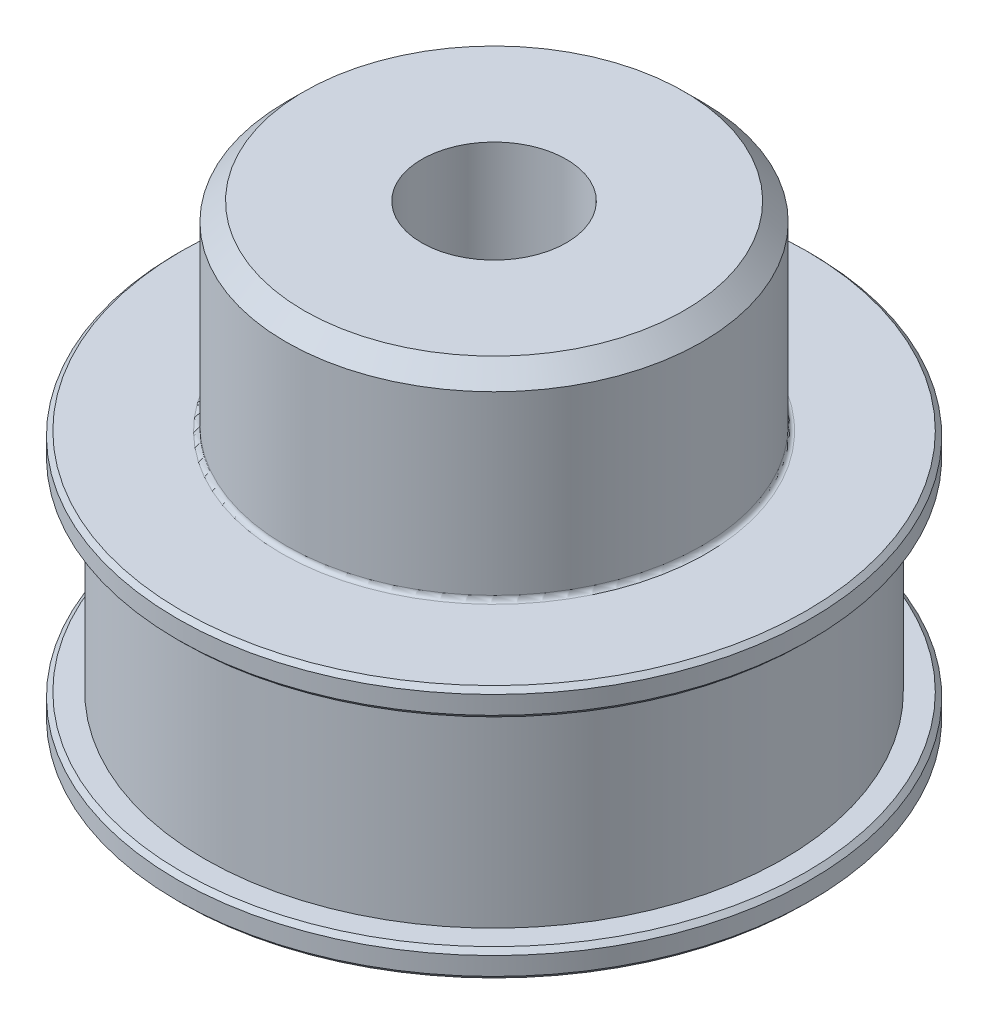
ISO-10303-21;
HEADER;
FILE_DESCRIPTION(('STEP AP214'),'2;1');
FILE_NAME('part.step','',(''),(''),'','','');
FILE_SCHEMA(('AUTOMOTIVE_DESIGN { 1 0 10303 214 1 1 1 1 }'));
ENDSEC;
DATA;
#1=APPLICATION_CONTEXT('core data for automotive mechanical design processes');
#2=APPLICATION_PROTOCOL_DEFINITION('international standard','automotive_design',2000,#1);
#3=PRODUCT_CONTEXT('',#1,'mechanical');
#4=PRODUCT('Part','Part','',(#3));
#5=PRODUCT_RELATED_PRODUCT_CATEGORY('part','',(#4));
#6=PRODUCT_DEFINITION_FORMATION('','',#4);
#7=PRODUCT_DEFINITION_CONTEXT('part definition',#1,'design');
#8=PRODUCT_DEFINITION('design','',#6,#7);
#9=PRODUCT_DEFINITION_SHAPE('','',#8);
#10=(LENGTH_UNIT() NAMED_UNIT(*) SI_UNIT(.MILLI.,.METRE.));
#11=(NAMED_UNIT(*) PLANE_ANGLE_UNIT() SI_UNIT($,.RADIAN.));
#12=(NAMED_UNIT(*) SI_UNIT($,.STERADIAN.) SOLID_ANGLE_UNIT());
#13=UNCERTAINTY_MEASURE_WITH_UNIT(LENGTH_MEASURE(1.E-05),#10,'distance_accuracy_value','');
#14=(GEOMETRIC_REPRESENTATION_CONTEXT(3) GLOBAL_UNCERTAINTY_ASSIGNED_CONTEXT((#13)) GLOBAL_UNIT_ASSIGNED_CONTEXT((#10,
#11,#12)) REPRESENTATION_CONTEXT('',''));
#15=CARTESIAN_POINT('',(0.,0.,0.));
#16=DIRECTION('',(0.,0.,1.));
#17=DIRECTION('',(1.,0.,0.));
#18=AXIS2_PLACEMENT_3D('',#15,#16,#17);
#19=CARTESIAN_POINT('',(0.,1.5,0.));
#20=DIRECTION('',(0.,-1.,0.));
#21=DIRECTION('',(0.,0.,-1.));
#22=AXIS2_PLACEMENT_3D('',#19,#20,#21);
#23=CYLINDRICAL_SURFACE('',#22,17.5);
#24=CARTESIAN_POINT('',(0.,0.25,0.));
#25=DIRECTION('',(0.,1.,0.));
#26=DIRECTION('',(0.,0.,1.));
#27=AXIS2_PLACEMENT_3D('',#24,#25,#26);
#28=CIRCLE('',#27,17.5);
#29=CARTESIAN_POINT('',(0.,0.25,17.5));
#30=VERTEX_POINT('',#29);
#31=EDGE_CURVE('E64',#30,#30,#28,.T.);
#32=ORIENTED_EDGE('',*,*,#31,.T.);
#33=EDGE_LOOP('',(#32));
#34=FACE_BOUND('',#33,.T.);
#35=CARTESIAN_POINT('',(0.,1.24999999999997,0.));
#36=DIRECTION('',(0.,1.,0.));
#37=DIRECTION('',(0.,0.,1.));
#38=AXIS2_PLACEMENT_3D('',#35,#36,#37);
#39=CIRCLE('',#38,17.5);
#40=CARTESIAN_POINT('',(0.,1.24999999999997,17.5));
#41=VERTEX_POINT('',#40);
#42=EDGE_CURVE('E67',#41,#41,#39,.F.);
#43=ORIENTED_EDGE('',*,*,#42,.T.);
#44=EDGE_LOOP('',(#43));
#45=FACE_BOUND('',#44,.T.);
#46=ADVANCED_FACE('F32',(#34,#45),#23,.T.);
#47=CARTESIAN_POINT('',(0.,1.5,0.));
#48=DIRECTION('',(0.,1.,0.));
#49=DIRECTION('',(0.,0.,1.));
#50=AXIS2_PLACEMENT_3D('',#47,#48,#49);
#51=PLANE('',#50);
#52=CARTESIAN_POINT('',(0.,1.5,0.));
#53=DIRECTION('',(0.,1.,0.));
#54=DIRECTION('',(0.,0.,1.));
#55=AXIS2_PLACEMENT_3D('',#52,#53,#54);
#56=CIRCLE('',#55,17.25);
#57=CARTESIAN_POINT('',(0.,1.5,17.25));
#58=VERTEX_POINT('',#57);
#59=EDGE_CURVE('E58',#58,#58,#56,.T.);
#60=ORIENTED_EDGE('',*,*,#59,.T.);
#61=EDGE_LOOP('',(#60));
#62=FACE_BOUND('',#61,.T.);
#63=CARTESIAN_POINT('',(0.,1.5,0.));
#64=DIRECTION('',(0.,1.,0.));
#65=DIRECTION('',(0.,0.,1.));
#66=AXIS2_PLACEMENT_3D('',#63,#64,#65);
#67=CIRCLE('',#66,16.);
#68=CARTESIAN_POINT('',(0.,1.5,16.));
#69=VERTEX_POINT('',#68);
#70=EDGE_CURVE('E80',#69,#69,#67,.T.);
#71=ORIENTED_EDGE('',*,*,#70,.F.);
#72=EDGE_LOOP('',(#71));
#73=FACE_BOUND('',#72,.T.);
#74=ADVANCED_FACE('F108',(#62,#73),#51,.T.);
#75=CARTESIAN_POINT('',(0.,0.,0.));
#76=DIRECTION('',(0.,1.,0.));
#77=DIRECTION('',(0.,0.,1.));
#78=AXIS2_PLACEMENT_3D('',#75,#76,#77);
#79=PLANE('',#78);
#80=CARTESIAN_POINT('',(0.,0.,0.));
#81=DIRECTION('',(0.,1.,0.));
#82=DIRECTION('',(0.,0.,1.));
#83=AXIS2_PLACEMENT_3D('',#80,#81,#82);
#84=CIRCLE('',#83,17.25);
#85=CARTESIAN_POINT('',(0.,0.,17.25));
#86=VERTEX_POINT('',#85);
#87=EDGE_CURVE('E61',#86,#86,#84,.F.);
#88=ORIENTED_EDGE('',*,*,#87,.T.);
#89=EDGE_LOOP('',(#88));
#90=FACE_BOUND('',#89,.T.);
#91=CARTESIAN_POINT('',(0.,0.,0.));
#92=DIRECTION('',(0.,1.,0.));
#93=DIRECTION('',(0.,0.,1.));
#94=AXIS2_PLACEMENT_3D('',#91,#92,#93);
#95=CIRCLE('',#94,4.);
#96=CARTESIAN_POINT('',(0.,0.,4.));
#97=VERTEX_POINT('',#96);
#98=EDGE_CURVE('E81',#97,#97,#95,.T.);
#99=ORIENTED_EDGE('',*,*,#98,.T.);
#100=EDGE_LOOP('',(#99));
#101=FACE_BOUND('',#100,.T.);
#102=ADVANCED_FACE('F89',(#90,#101),#79,.F.);
#103=CARTESIAN_POINT('',(0.,12.5,0.));
#104=DIRECTION('',(0.,-1.,0.));
#105=DIRECTION('',(0.,0.,-1.));
#106=AXIS2_PLACEMENT_3D('',#103,#104,#105);
#107=CYLINDRICAL_SURFACE('',#106,16.);
#108=CARTESIAN_POINT('',(0.,12.5,0.));
#109=DIRECTION('',(0.,1.,0.));
#110=DIRECTION('',(0.,0.,1.));
#111=AXIS2_PLACEMENT_3D('',#108,#109,#110);
#112=CIRCLE('',#111,16.);
#113=CARTESIAN_POINT('',(0.,12.5,16.));
#114=VERTEX_POINT('',#113);
#115=EDGE_CURVE('E76',#114,#114,#112,.T.);
#116=ORIENTED_EDGE('',*,*,#115,.F.);
#117=EDGE_LOOP('',(#116));
#118=FACE_BOUND('',#117,.T.);
#119=ORIENTED_EDGE('',*,*,#70,.T.);
#120=EDGE_LOOP('',(#119));
#121=FACE_BOUND('',#120,.T.);
#122=ADVANCED_FACE('F151',(#118,#121),#107,.T.);
#123=CARTESIAN_POINT('',(0.,14.,0.));
#124=DIRECTION('',(0.,-1.,0.));
#125=DIRECTION('',(0.,0.,-1.));
#126=AXIS2_PLACEMENT_3D('',#123,#124,#125);
#127=CYLINDRICAL_SURFACE('',#126,17.5);
#128=CARTESIAN_POINT('',(0.,12.75,0.));
#129=DIRECTION('',(0.,1.,0.));
#130=DIRECTION('',(0.,0.,1.));
#131=AXIS2_PLACEMENT_3D('',#128,#129,#130);
#132=CIRCLE('',#131,17.5);
#133=CARTESIAN_POINT('',(0.,12.75,17.5));
#134=VERTEX_POINT('',#133);
#135=EDGE_CURVE('E52',#134,#134,#132,.T.);
#136=ORIENTED_EDGE('',*,*,#135,.T.);
#137=EDGE_LOOP('',(#136));
#138=FACE_BOUND('',#137,.T.);
#139=CARTESIAN_POINT('',(0.,13.75,0.));
#140=DIRECTION('',(0.,1.,0.));
#141=DIRECTION('',(0.,0.,1.));
#142=AXIS2_PLACEMENT_3D('',#139,#140,#141);
#143=CIRCLE('',#142,17.5);
#144=CARTESIAN_POINT('',(0.,13.75,17.5));
#145=VERTEX_POINT('',#144);
#146=EDGE_CURVE('E55',#145,#145,#143,.F.);
#147=ORIENTED_EDGE('',*,*,#146,.T.);
#148=EDGE_LOOP('',(#147));
#149=FACE_BOUND('',#148,.T.);
#150=ADVANCED_FACE('F143',(#138,#149),#127,.T.);
#151=CARTESIAN_POINT('',(0.,14.,0.));
#152=DIRECTION('',(0.,1.,0.));
#153=DIRECTION('',(0.,0.,1.));
#154=AXIS2_PLACEMENT_3D('',#151,#152,#153);
#155=PLANE('',#154);
#156=CARTESIAN_POINT('',(0.,14.,0.));
#157=DIRECTION('',(0.,1.,0.));
#158=DIRECTION('',(0.,0.,1.));
#159=AXIS2_PLACEMENT_3D('',#156,#157,#158);
#160=CIRCLE('',#159,11.75);
#161=CARTESIAN_POINT('',(0.,14.,11.75));
#162=VERTEX_POINT('',#161);
#163=EDGE_CURVE('E10',#162,#162,#160,.F.);
#164=ORIENTED_EDGE('',*,*,#163,.T.);
#165=EDGE_LOOP('',(#164));
#166=FACE_BOUND('',#165,.T.);
#167=CARTESIAN_POINT('',(0.,14.,0.));
#168=DIRECTION('',(0.,1.,0.));
#169=DIRECTION('',(0.,0.,1.));
#170=AXIS2_PLACEMENT_3D('',#167,#168,#169);
#171=CIRCLE('',#170,17.25);
#172=CARTESIAN_POINT('',(0.,14.,17.25));
#173=VERTEX_POINT('',#172);
#174=EDGE_CURVE('E43',#173,#173,#171,.T.);
#175=ORIENTED_EDGE('',*,*,#174,.T.);
#176=EDGE_LOOP('',(#175));
#177=FACE_BOUND('',#176,.T.);
#178=ADVANCED_FACE('F140',(#166,#177),#155,.T.);
#179=CARTESIAN_POINT('',(0.,12.5,0.));
#180=DIRECTION('',(0.,1.,0.));
#181=DIRECTION('',(0.,0.,1.));
#182=AXIS2_PLACEMENT_3D('',#179,#180,#181);
#183=PLANE('',#182);
#184=CARTESIAN_POINT('',(0.,12.5,0.));
#185=DIRECTION('',(0.,1.,0.));
#186=DIRECTION('',(0.,0.,1.));
#187=AXIS2_PLACEMENT_3D('',#184,#185,#186);
#188=CIRCLE('',#187,17.25);
#189=CARTESIAN_POINT('',(0.,12.5,17.25));
#190=VERTEX_POINT('',#189);
#191=EDGE_CURVE('E47',#190,#190,#188,.F.);
#192=ORIENTED_EDGE('',*,*,#191,.T.);
#193=EDGE_LOOP('',(#192));
#194=FACE_BOUND('',#193,.T.);
#195=ORIENTED_EDGE('',*,*,#115,.T.);
#196=EDGE_LOOP('',(#195));
#197=FACE_BOUND('',#196,.T.);
#198=ADVANCED_FACE('F142',(#194,#197),#183,.F.);
#199=CARTESIAN_POINT('',(0.,25.,0.));
#200=DIRECTION('',(0.,-1.,0.));
#201=DIRECTION('',(0.,0.,-1.));
#202=AXIS2_PLACEMENT_3D('',#199,#200,#201);
#203=CYLINDRICAL_SURFACE('',#202,11.5);
#204=CARTESIAN_POINT('',(0.,14.25,0.));
#205=DIRECTION('',(0.,1.,0.));
#206=DIRECTION('',(0.,0.,1.));
#207=AXIS2_PLACEMENT_3D('',#204,#205,#206);
#208=CIRCLE('',#207,11.5);
#209=CARTESIAN_POINT('',(0.,14.25,11.5));
#210=VERTEX_POINT('',#209);
#211=EDGE_CURVE('E39',#210,#210,#208,.T.);
#212=ORIENTED_EDGE('',*,*,#211,.T.);
#213=EDGE_LOOP('',(#212));
#214=FACE_BOUND('',#213,.T.);
#215=CARTESIAN_POINT('',(0.,24.,0.));
#216=DIRECTION('',(0.,1.,0.));
#217=DIRECTION('',(0.,0.,1.));
#218=AXIS2_PLACEMENT_3D('',#215,#216,#217);
#219=CIRCLE('',#218,11.5);
#220=CARTESIAN_POINT('',(0.,24.,11.5));
#221=VERTEX_POINT('',#220);
#222=EDGE_CURVE('E70',#221,#221,#219,.F.);
#223=ORIENTED_EDGE('',*,*,#222,.T.);
#224=EDGE_LOOP('',(#223));
#225=FACE_BOUND('',#224,.T.);
#226=ADVANCED_FACE('F104',(#214,#225),#203,.T.);
#227=CARTESIAN_POINT('',(0.,25.,0.));
#228=DIRECTION('',(0.,1.,0.));
#229=DIRECTION('',(0.,0.,1.));
#230=AXIS2_PLACEMENT_3D('',#227,#228,#229);
#231=PLANE('',#230);
#232=CARTESIAN_POINT('',(0.,25.,0.));
#233=DIRECTION('',(0.,1.,0.));
#234=DIRECTION('',(0.,0.,1.));
#235=AXIS2_PLACEMENT_3D('',#232,#233,#234);
#236=CIRCLE('',#235,10.5);
#237=CARTESIAN_POINT('',(0.,25.,10.5));
#238=VERTEX_POINT('',#237);
#239=EDGE_CURVE('E73',#238,#238,#236,.T.);
#240=ORIENTED_EDGE('',*,*,#239,.T.);
#241=EDGE_LOOP('',(#240));
#242=FACE_BOUND('',#241,.T.);
#243=CARTESIAN_POINT('',(0.,25.,0.));
#244=DIRECTION('',(0.,1.,0.));
#245=DIRECTION('',(0.,0.,1.));
#246=AXIS2_PLACEMENT_3D('',#243,#244,#245);
#247=CIRCLE('',#246,4.);
#248=CARTESIAN_POINT('',(0.,25.,4.));
#249=VERTEX_POINT('',#248);
#250=EDGE_CURVE('E77',#249,#249,#247,.T.);
#251=ORIENTED_EDGE('',*,*,#250,.F.);
#252=EDGE_LOOP('',(#251));
#253=FACE_BOUND('',#252,.T.);
#254=ADVANCED_FACE('F94',(#242,#253),#231,.T.);
#255=CARTESIAN_POINT('',(0.,0.,0.));
#256=DIRECTION('',(0.,1.,0.));
#257=DIRECTION('',(0.,0.,1.));
#258=AXIS2_PLACEMENT_3D('',#255,#256,#257);
#259=CYLINDRICAL_SURFACE('',#258,4.);
#260=CARTESIAN_POINT('',(0.,25.,4.));
#261=CARTESIAN_POINT('',(0.,24.7395833333333,4.));
#262=CARTESIAN_POINT('',(0.,24.4791666666667,4.));
#263=CARTESIAN_POINT('',(0.,23.9583333333333,4.));
#264=CARTESIAN_POINT('',(0.,23.6979166666667,4.));
#265=CARTESIAN_POINT('',(0.,23.1770833333333,4.));
#266=CARTESIAN_POINT('',(0.,22.9166666666667,4.));
#267=CARTESIAN_POINT('',(0.,22.3958333333333,4.));
#268=CARTESIAN_POINT('',(0.,22.1354166666667,4.));
#269=CARTESIAN_POINT('',(0.,21.6145833333333,4.));
#270=CARTESIAN_POINT('',(0.,21.3541666666667,4.));
#271=CARTESIAN_POINT('',(0.,20.8333333333333,4.));
#272=CARTESIAN_POINT('',(0.,20.5729166666667,4.));
#273=CARTESIAN_POINT('',(0.,20.0520833333333,4.));
#274=CARTESIAN_POINT('',(0.,19.7916666666667,4.));
#275=CARTESIAN_POINT('',(0.,19.2708333333333,4.));
#276=CARTESIAN_POINT('',(0.,19.0104166666667,4.));
#277=CARTESIAN_POINT('',(0.,18.4895833333333,4.));
#278=CARTESIAN_POINT('',(0.,18.2291666666667,4.));
#279=CARTESIAN_POINT('',(0.,17.7083333333333,4.));
#280=CARTESIAN_POINT('',(0.,17.4479166666667,4.));
#281=CARTESIAN_POINT('',(0.,16.9270833333333,4.));
#282=CARTESIAN_POINT('',(0.,16.6666666666667,4.));
#283=CARTESIAN_POINT('',(0.,16.1458333333333,4.));
#284=CARTESIAN_POINT('',(0.,15.8854166666667,4.));
#285=CARTESIAN_POINT('',(0.,15.3645833333333,4.));
#286=CARTESIAN_POINT('',(0.,15.1041666666667,4.));
#287=CARTESIAN_POINT('',(0.,14.5833333333333,4.));
#288=CARTESIAN_POINT('',(0.,14.3229166666667,4.));
#289=CARTESIAN_POINT('',(0.,13.8020833333333,4.));
#290=CARTESIAN_POINT('',(0.,13.5416666666667,4.));
#291=CARTESIAN_POINT('',(0.,13.0208333333333,4.));
#292=CARTESIAN_POINT('',(0.,12.7604166666667,4.));
#293=CARTESIAN_POINT('',(0.,12.2395833333333,4.));
#294=CARTESIAN_POINT('',(0.,11.9791666666667,4.));
#295=CARTESIAN_POINT('',(0.,11.4583333333333,4.));
#296=CARTESIAN_POINT('',(0.,11.1979166666667,4.));
#297=CARTESIAN_POINT('',(0.,10.6770833333333,4.));
#298=CARTESIAN_POINT('',(0.,10.4166666666667,4.));
#299=CARTESIAN_POINT('',(0.,9.89583333333333,4.));
#300=CARTESIAN_POINT('',(0.,9.63541666666667,4.));
#301=CARTESIAN_POINT('',(0.,9.11458333333333,4.));
#302=CARTESIAN_POINT('',(0.,8.85416666666667,4.));
#303=CARTESIAN_POINT('',(0.,8.33333333333333,4.));
#304=CARTESIAN_POINT('',(0.,8.07291666666667,4.));
#305=CARTESIAN_POINT('',(0.,7.55208333333333,4.));
#306=CARTESIAN_POINT('',(0.,7.29166666666667,4.));
#307=CARTESIAN_POINT('',(0.,6.77083333333333,4.));
#308=CARTESIAN_POINT('',(0.,6.51041666666666,4.));
#309=CARTESIAN_POINT('',(0.,5.98958333333333,4.));
#310=CARTESIAN_POINT('',(0.,5.72916666666667,4.));
#311=CARTESIAN_POINT('',(0.,5.20833333333333,4.));
#312=CARTESIAN_POINT('',(0.,4.94791666666667,4.));
#313=CARTESIAN_POINT('',(0.,4.42708333333333,4.));
#314=CARTESIAN_POINT('',(0.,4.16666666666667,4.));
#315=CARTESIAN_POINT('',(0.,3.64583333333333,4.));
#316=CARTESIAN_POINT('',(0.,3.38541666666667,4.));
#317=CARTESIAN_POINT('',(0.,2.86458333333333,4.));
#318=CARTESIAN_POINT('',(0.,2.60416666666667,4.));
#319=CARTESIAN_POINT('',(0.,2.08333333333333,4.));
#320=CARTESIAN_POINT('',(0.,1.82291666666667,4.));
#321=CARTESIAN_POINT('',(0.,1.30208333333333,4.));
#322=CARTESIAN_POINT('',(0.,1.04166666666667,4.));
#323=CARTESIAN_POINT('',(0.,0.520833333333334,4.));
#324=CARTESIAN_POINT('',(0.,0.260416666666667,4.));
#325=CARTESIAN_POINT('',(0.,0.,4.));
#326=B_SPLINE_CURVE_WITH_KNOTS('',3,(#260,#261,#262,#263,#264,#265,#266,#267,#268,#269,#270,
#271,#272,#273,#274,#275,#276,#277,#278,#279,#280,#281,#282,#283,#284,#285,#286,#287,#288,#289,
#290,#291,#292,#293,#294,#295,#296,#297,#298,#299,#300,#301,#302,#303,#304,#305,#306,#307,#308,
#309,#310,#311,#312,#313,#314,#315,#316,#317,#318,#319,#320,#321,#322,#323,#324,#325),
.UNSPECIFIED.,.F.,.F.,(4,2,2,2,2,2,2,2,2,2,2,2,2,2,2,2,2,2,2,2,2,2,2,2,2,2,2,2,2,2,2,2,4),(0.,
0.781250000000001,1.5625,2.34375,3.125,3.90625,4.6875,5.46875,6.25,7.03125,7.8125,8.59375,9.375,
10.15625,10.9375,11.71875,12.5,13.28125,14.0625,14.84375,15.625,16.40625,17.1875,17.96875,18.75,
19.53125,20.3125,21.09375,21.875,22.65625,23.4375,24.21875,25.),.UNSPECIFIED.);
#327=EDGE_CURVE('BSEAM91',#249,#97,#326,.T.);
#328=ORIENTED_EDGE('',*,*,#250,.T.);
#329=ORIENTED_EDGE('',*,*,#98,.F.);
#330=ORIENTED_EDGE('',*,*,#327,.T.);
#331=ORIENTED_EDGE('',*,*,#327,.F.);
#332=EDGE_LOOP('',(#328,#330,#329,#331));
#333=FACE_BOUND('',#332,.T.);
#334=ADVANCED_FACE('F91',(#333),#259,.F.);
#335=CARTESIAN_POINT('',(0.,25.,0.));
#336=DIRECTION('',(0.,-1.,0.));
#337=DIRECTION('',(0.,0.,-1.));
#338=AXIS2_PLACEMENT_3D('',#335,#336,#337);
#339=CONICAL_SURFACE('',#338,10.5,0.785398163397448);
#340=ORIENTED_EDGE('',*,*,#222,.F.);
#341=EDGE_LOOP('',(#340));
#342=FACE_BOUND('',#341,.T.);
#343=ORIENTED_EDGE('',*,*,#239,.F.);
#344=EDGE_LOOP('',(#343));
#345=FACE_BOUND('',#344,.T.);
#346=ADVANCED_FACE('F93',(#342,#345),#339,.T.);
#347=CARTESIAN_POINT('',(0.,0.25,0.));
#348=DIRECTION('',(0.,1.,0.));
#349=DIRECTION('',(0.,0.,1.));
#350=AXIS2_PLACEMENT_3D('',#347,#348,#349);
#351=CONICAL_SURFACE('',#350,17.5,0.785398163397455);
#352=ORIENTED_EDGE('',*,*,#87,.F.);
#353=EDGE_LOOP('',(#352));
#354=FACE_BOUND('',#353,.T.);
#355=ORIENTED_EDGE('',*,*,#31,.F.);
#356=EDGE_LOOP('',(#355));
#357=FACE_BOUND('',#356,.T.);
#358=ADVANCED_FACE('F101',(#354,#357),#351,.T.);
#359=CARTESIAN_POINT('',(0.,1.5,0.));
#360=DIRECTION('',(0.,-1.,0.));
#361=DIRECTION('',(0.,0.,-1.));
#362=AXIS2_PLACEMENT_3D('',#359,#360,#361);
#363=CONICAL_SURFACE('',#362,17.25,0.785398163397441);
#364=ORIENTED_EDGE('',*,*,#42,.F.);
#365=EDGE_LOOP('',(#364));
#366=FACE_BOUND('',#365,.T.);
#367=ORIENTED_EDGE('',*,*,#59,.F.);
#368=EDGE_LOOP('',(#367));
#369=FACE_BOUND('',#368,.T.);
#370=ADVANCED_FACE('F121',(#366,#369),#363,.T.);
#371=CARTESIAN_POINT('',(0.,12.75,0.));
#372=DIRECTION('',(0.,1.,0.));
#373=DIRECTION('',(0.,0.,1.));
#374=AXIS2_PLACEMENT_3D('',#371,#372,#373);
#375=CONICAL_SURFACE('',#374,17.5,0.785398163397441);
#376=ORIENTED_EDGE('',*,*,#191,.F.);
#377=EDGE_LOOP('',(#376));
#378=FACE_BOUND('',#377,.T.);
#379=ORIENTED_EDGE('',*,*,#135,.F.);
#380=EDGE_LOOP('',(#379));
#381=FACE_BOUND('',#380,.T.);
#382=ADVANCED_FACE('F125',(#378,#381),#375,.T.);
#383=CARTESIAN_POINT('',(0.,14.,0.));
#384=DIRECTION('',(0.,-1.,0.));
#385=DIRECTION('',(0.,0.,-1.));
#386=AXIS2_PLACEMENT_3D('',#383,#384,#385);
#387=CONICAL_SURFACE('',#386,17.25,0.785398163397441);
#388=ORIENTED_EDGE('',*,*,#146,.F.);
#389=EDGE_LOOP('',(#388));
#390=FACE_BOUND('',#389,.T.);
#391=ORIENTED_EDGE('',*,*,#174,.F.);
#392=EDGE_LOOP('',(#391));
#393=FACE_BOUND('',#392,.T.);
#394=ADVANCED_FACE('F128',(#390,#393),#387,.T.);
#395=CARTESIAN_POINT('',(0.,14.25,0.));
#396=DIRECTION('',(0.,1.,0.));
#397=DIRECTION('',(0.,0.,1.));
#398=AXIS2_PLACEMENT_3D('',#395,#396,#397);
#399=TOROIDAL_SURFACE('',#398,11.75,0.25);
#400=ORIENTED_EDGE('',*,*,#163,.F.);
#401=EDGE_LOOP('',(#400));
#402=FACE_BOUND('',#401,.T.);
#403=ORIENTED_EDGE('',*,*,#211,.F.);
#404=EDGE_LOOP('',(#403));
#405=FACE_BOUND('',#404,.T.);
#406=ADVANCED_FACE('F34',(#402,#405),#399,.F.);
#407=CLOSED_SHELL('',(#46,#74,#102,#122,#150,#178,#198,#226,#254,#334,#346,#358,#370,#382,#394,#406));
#408=MANIFOLD_SOLID_BREP('B2',#407);
#409=ADVANCED_BREP_SHAPE_REPRESENTATION('',(#18,#408),#14);
#410=SHAPE_DEFINITION_REPRESENTATION(#9,#409);
ENDSEC;
END-ISO-10303-21;
